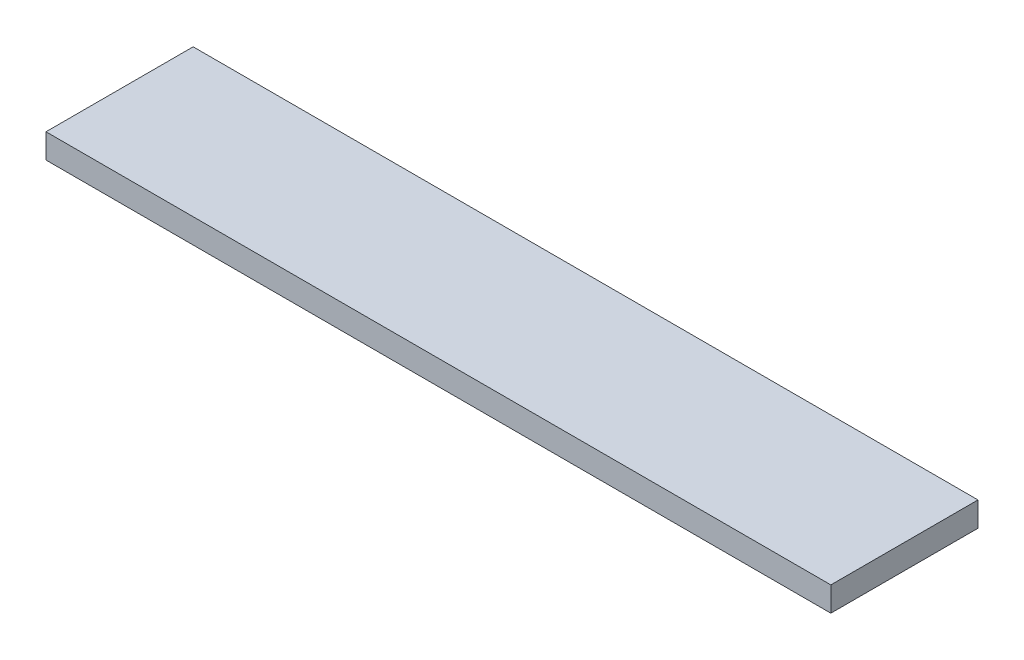
ISO-10303-21;
HEADER;
FILE_DESCRIPTION(('STEP AP214'),'2;1');
FILE_NAME('part.step','',(''),(''),'','','');
FILE_SCHEMA(('AUTOMOTIVE_DESIGN { 1 0 10303 214 1 1 1 1 }'));
ENDSEC;
DATA;
#1=APPLICATION_CONTEXT('core data for automotive mechanical design processes');
#2=APPLICATION_PROTOCOL_DEFINITION('international standard','automotive_design',2000,#1);
#3=PRODUCT_CONTEXT('',#1,'mechanical');
#4=PRODUCT('Part','Part','',(#3));
#5=PRODUCT_RELATED_PRODUCT_CATEGORY('part','',(#4));
#6=PRODUCT_DEFINITION_FORMATION('','',#4);
#7=PRODUCT_DEFINITION_CONTEXT('part definition',#1,'design');
#8=PRODUCT_DEFINITION('design','',#6,#7);
#9=PRODUCT_DEFINITION_SHAPE('','',#8);
#10=(LENGTH_UNIT() NAMED_UNIT(*) SI_UNIT(.MILLI.,.METRE.));
#11=(NAMED_UNIT(*) PLANE_ANGLE_UNIT() SI_UNIT($,.RADIAN.));
#12=(NAMED_UNIT(*) SI_UNIT($,.STERADIAN.) SOLID_ANGLE_UNIT());
#13=UNCERTAINTY_MEASURE_WITH_UNIT(LENGTH_MEASURE(1.E-05),#10,'distance_accuracy_value','');
#14=(GEOMETRIC_REPRESENTATION_CONTEXT(3) GLOBAL_UNCERTAINTY_ASSIGNED_CONTEXT((#13)) GLOBAL_UNIT_ASSIGNED_CONTEXT((#10,
#11,#12)) REPRESENTATION_CONTEXT('',''));
#15=CARTESIAN_POINT('',(0.,0.,0.));
#16=DIRECTION('',(0.,0.,1.));
#17=DIRECTION('',(1.,0.,0.));
#18=AXIS2_PLACEMENT_3D('',#15,#16,#17);
#19=CARTESIAN_POINT('',(-203.2,0.,76.2));
#20=DIRECTION('',(1.,0.,0.));
#21=DIRECTION('',(0.,1.,0.));
#22=AXIS2_PLACEMENT_3D('',#19,#20,#21);
#23=PLANE('',#22);
#24=DIRECTION('',(0.,-1.,0.));
#25=VECTOR('',#24,1.);
#26=CARTESIAN_POINT('',(-203.2,0.,0.));
#27=LINE('',#26,#25);
#28=CARTESIAN_POINT('',(-203.2,0.,0.));
#29=VERTEX_POINT('',#28);
#30=CARTESIAN_POINT('',(-203.2,-12.7,0.));
#31=VERTEX_POINT('',#30);
#32=EDGE_CURVE('E99',#29,#31,#27,.T.);
#33=ORIENTED_EDGE('',*,*,#32,.T.);
#34=DIRECTION('',(0.,0.,-1.));
#35=VECTOR('',#34,1.);
#36=CARTESIAN_POINT('',(-203.2,-12.7,76.2));
#37=LINE('',#36,#35);
#38=CARTESIAN_POINT('',(-203.2,-12.7,76.2));
#39=VERTEX_POINT('',#38);
#40=EDGE_CURVE('E11',#39,#31,#37,.T.);
#41=ORIENTED_EDGE('',*,*,#40,.F.);
#42=DIRECTION('',(0.,-1.,0.));
#43=VECTOR('',#42,1.);
#44=CARTESIAN_POINT('',(-203.2,0.,76.2));
#45=LINE('',#44,#43);
#46=CARTESIAN_POINT('',(-203.2,0.,76.2));
#47=VERTEX_POINT('',#46);
#48=EDGE_CURVE('E87',#47,#39,#45,.T.);
#49=ORIENTED_EDGE('',*,*,#48,.F.);
#50=DIRECTION('',(0.,0.,-1.));
#51=VECTOR('',#50,1.);
#52=CARTESIAN_POINT('',(-203.2,0.,76.2));
#53=LINE('',#52,#51);
#54=EDGE_CURVE('E95',#47,#29,#53,.T.);
#55=ORIENTED_EDGE('',*,*,#54,.T.);
#56=EDGE_LOOP('',(#33,#41,#49,#55));
#57=FACE_BOUND('',#56,.T.);
#58=ADVANCED_FACE('F36',(#57),#23,.F.);
#59=CARTESIAN_POINT('',(-203.2,-12.7,76.2));
#60=DIRECTION('',(0.,1.,0.));
#61=DIRECTION('',(-1.,0.,0.));
#62=AXIS2_PLACEMENT_3D('',#59,#60,#61);
#63=PLANE('',#62);
#64=DIRECTION('',(1.,0.,0.));
#65=VECTOR('',#64,1.);
#66=CARTESIAN_POINT('',(-203.2,-12.7,0.));
#67=LINE('',#66,#65);
#68=CARTESIAN_POINT('',(203.2,-12.7,0.));
#69=VERTEX_POINT('',#68);
#70=EDGE_CURVE('E91',#31,#69,#67,.T.);
#71=ORIENTED_EDGE('',*,*,#70,.T.);
#72=DIRECTION('',(0.,0.,-1.));
#73=VECTOR('',#72,1.);
#74=CARTESIAN_POINT('',(203.2,-12.7,76.2));
#75=LINE('',#74,#73);
#76=CARTESIAN_POINT('',(203.2,-12.7,76.2));
#77=VERTEX_POINT('',#76);
#78=EDGE_CURVE('E44',#77,#69,#75,.T.);
#79=ORIENTED_EDGE('',*,*,#78,.F.);
#80=DIRECTION('',(1.,0.,0.));
#81=VECTOR('',#80,1.);
#82=CARTESIAN_POINT('',(-203.2,-12.7,76.2));
#83=LINE('',#82,#81);
#84=EDGE_CURVE('E82',#39,#77,#83,.T.);
#85=ORIENTED_EDGE('',*,*,#84,.F.);
#86=ORIENTED_EDGE('',*,*,#40,.T.);
#87=EDGE_LOOP('',(#71,#79,#85,#86));
#88=FACE_BOUND('',#87,.T.);
#89=ADVANCED_FACE('F90',(#88),#63,.F.);
#90=CARTESIAN_POINT('',(203.2,0.,76.2));
#91=DIRECTION('',(-1.,0.,0.));
#92=DIRECTION('',(0.,0.,1.));
#93=AXIS2_PLACEMENT_3D('',#90,#91,#92);
#94=PLANE('',#93);
#95=DIRECTION('',(0.,1.,0.));
#96=VECTOR('',#95,1.);
#97=CARTESIAN_POINT('',(203.2,0.,0.));
#98=LINE('',#97,#96);
#99=CARTESIAN_POINT('',(203.2,0.,0.));
#100=VERTEX_POINT('',#99);
#101=EDGE_CURVE('E69',#69,#100,#98,.T.);
#102=ORIENTED_EDGE('',*,*,#101,.T.);
#103=DIRECTION('',(0.,0.,-1.));
#104=VECTOR('',#103,1.);
#105=CARTESIAN_POINT('',(203.2,0.,76.2));
#106=LINE('',#105,#104);
#107=CARTESIAN_POINT('',(203.2,0.,76.2));
#108=VERTEX_POINT('',#107);
#109=EDGE_CURVE('E92',#108,#100,#106,.T.);
#110=ORIENTED_EDGE('',*,*,#109,.F.);
#111=DIRECTION('',(0.,1.,0.));
#112=VECTOR('',#111,1.);
#113=CARTESIAN_POINT('',(203.2,0.,76.2));
#114=LINE('',#113,#112);
#115=EDGE_CURVE('E85',#77,#108,#114,.T.);
#116=ORIENTED_EDGE('',*,*,#115,.F.);
#117=ORIENTED_EDGE('',*,*,#78,.T.);
#118=EDGE_LOOP('',(#102,#110,#116,#117));
#119=FACE_BOUND('',#118,.T.);
#120=ADVANCED_FACE('F93',(#119),#94,.F.);
#121=CARTESIAN_POINT('',(-203.2,0.,76.2));
#122=DIRECTION('',(0.,-1.,0.));
#123=DIRECTION('',(0.,0.,-1.));
#124=AXIS2_PLACEMENT_3D('',#121,#122,#123);
#125=PLANE('',#124);
#126=DIRECTION('',(-1.,0.,0.));
#127=VECTOR('',#126,1.);
#128=CARTESIAN_POINT('',(-203.2,0.,0.));
#129=LINE('',#128,#127);
#130=EDGE_CURVE('E75',#100,#29,#129,.T.);
#131=ORIENTED_EDGE('',*,*,#130,.T.);
#132=ORIENTED_EDGE('',*,*,#54,.F.);
#133=DIRECTION('',(-1.,0.,0.));
#134=VECTOR('',#133,1.);
#135=CARTESIAN_POINT('',(-203.2,0.,76.2));
#136=LINE('',#135,#134);
#137=EDGE_CURVE('E52',#108,#47,#136,.T.);
#138=ORIENTED_EDGE('',*,*,#137,.F.);
#139=ORIENTED_EDGE('',*,*,#109,.T.);
#140=EDGE_LOOP('',(#131,#132,#138,#139));
#141=FACE_BOUND('',#140,.T.);
#142=ADVANCED_FACE('F106',(#141),#125,.F.);
#143=CARTESIAN_POINT('',(0.,0.,76.2));
#144=DIRECTION('',(0.,0.,1.));
#145=DIRECTION('',(1.,0.,0.));
#146=AXIS2_PLACEMENT_3D('',#143,#144,#145);
#147=PLANE('',#146);
#148=ORIENTED_EDGE('',*,*,#48,.T.);
#149=ORIENTED_EDGE('',*,*,#84,.T.);
#150=ORIENTED_EDGE('',*,*,#115,.T.);
#151=ORIENTED_EDGE('',*,*,#137,.T.);
#152=EDGE_LOOP('',(#148,#149,#150,#151));
#153=FACE_BOUND('',#152,.T.);
#154=ADVANCED_FACE('F83',(#153),#147,.T.);
#155=CARTESIAN_POINT('',(0.,0.,0.));
#156=DIRECTION('',(0.,0.,1.));
#157=DIRECTION('',(1.,0.,0.));
#158=AXIS2_PLACEMENT_3D('',#155,#156,#157);
#159=PLANE('',#158);
#160=ORIENTED_EDGE('',*,*,#32,.F.);
#161=ORIENTED_EDGE('',*,*,#130,.F.);
#162=ORIENTED_EDGE('',*,*,#101,.F.);
#163=ORIENTED_EDGE('',*,*,#70,.F.);
#164=EDGE_LOOP('',(#160,#161,#162,#163));
#165=FACE_BOUND('',#164,.T.);
#166=ADVANCED_FACE('F109',(#165),#159,.F.);
#167=CLOSED_SHELL('',(#58,#89,#120,#142,#154,#166));
#168=MANIFOLD_SOLID_BREP('B2',#167);
#169=ADVANCED_BREP_SHAPE_REPRESENTATION('',(#18,#168),#14);
#170=SHAPE_DEFINITION_REPRESENTATION(#9,#169);
ENDSEC;
END-ISO-10303-21;
